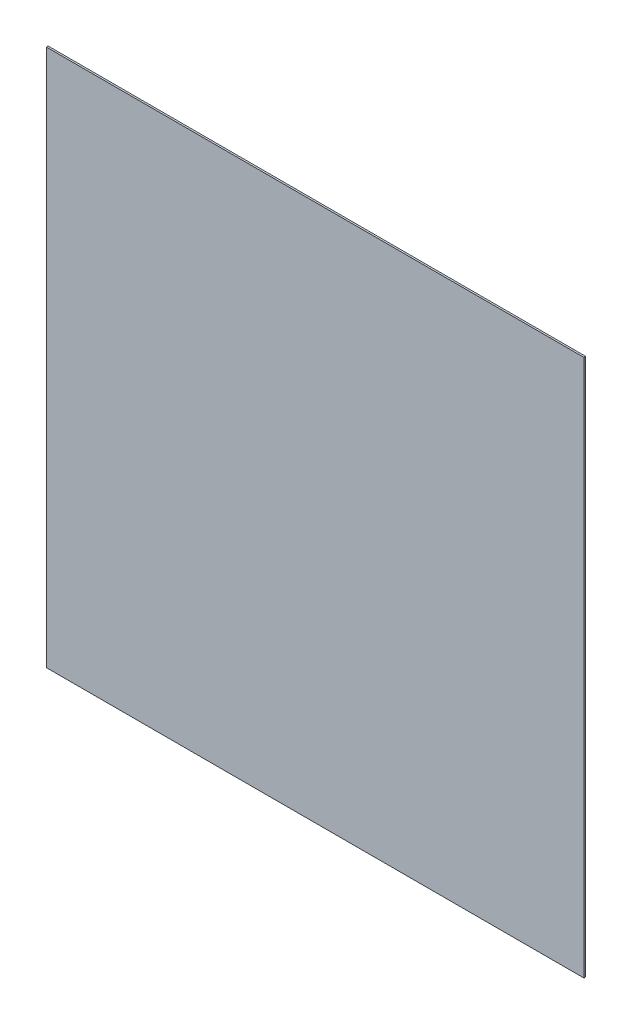
ISO-10303-21;
HEADER;
FILE_DESCRIPTION(('STEP AP214'),'2;1');
FILE_NAME('part.step','',(''),(''),'','','');
FILE_SCHEMA(('AUTOMOTIVE_DESIGN { 1 0 10303 214 1 1 1 1 }'));
ENDSEC;
DATA;
#1=APPLICATION_CONTEXT('core data for automotive mechanical design processes');
#2=APPLICATION_PROTOCOL_DEFINITION('international standard','automotive_design',2000,#1);
#3=PRODUCT_CONTEXT('',#1,'mechanical');
#4=PRODUCT('Part','Part','',(#3));
#5=PRODUCT_RELATED_PRODUCT_CATEGORY('part','',(#4));
#6=PRODUCT_DEFINITION_FORMATION('','',#4);
#7=PRODUCT_DEFINITION_CONTEXT('part definition',#1,'design');
#8=PRODUCT_DEFINITION('design','',#6,#7);
#9=PRODUCT_DEFINITION_SHAPE('','',#8);
#10=(LENGTH_UNIT() NAMED_UNIT(*) SI_UNIT(.MILLI.,.METRE.));
#11=(NAMED_UNIT(*) PLANE_ANGLE_UNIT() SI_UNIT($,.RADIAN.));
#12=(NAMED_UNIT(*) SI_UNIT($,.STERADIAN.) SOLID_ANGLE_UNIT());
#13=UNCERTAINTY_MEASURE_WITH_UNIT(LENGTH_MEASURE(1.E-05),#10,'distance_accuracy_value','');
#14=(GEOMETRIC_REPRESENTATION_CONTEXT(3) GLOBAL_UNCERTAINTY_ASSIGNED_CONTEXT((#13)) GLOBAL_UNIT_ASSIGNED_CONTEXT((#10,
#11,#12)) REPRESENTATION_CONTEXT('',''));
#15=CARTESIAN_POINT('',(0.,0.,0.));
#16=DIRECTION('',(0.,0.,1.));
#17=DIRECTION('',(1.,0.,0.));
#18=AXIS2_PLACEMENT_3D('',#15,#16,#17);
#19=CARTESIAN_POINT('',(150.,-150.,1.));
#20=DIRECTION('',(-1.,0.,0.));
#21=DIRECTION('',(0.,0.,1.));
#22=AXIS2_PLACEMENT_3D('',#19,#20,#21);
#23=PLANE('',#22);
#24=DIRECTION('',(0.,1.,0.));
#25=VECTOR('',#24,1.);
#26=CARTESIAN_POINT('',(150.,-150.,0.));
#27=LINE('',#26,#25);
#28=CARTESIAN_POINT('',(150.,-150.,0.));
#29=VERTEX_POINT('',#28);
#30=CARTESIAN_POINT('',(150.,150.,0.));
#31=VERTEX_POINT('',#30);
#32=EDGE_CURVE('E107',#29,#31,#27,.T.);
#33=ORIENTED_EDGE('',*,*,#32,.T.);
#34=DIRECTION('',(0.,0.,-1.));
#35=VECTOR('',#34,1.);
#36=CARTESIAN_POINT('',(150.,150.,1.));
#37=LINE('',#36,#35);
#38=CARTESIAN_POINT('',(150.,150.,1.));
#39=VERTEX_POINT('',#38);
#40=EDGE_CURVE('E11',#39,#31,#37,.T.);
#41=ORIENTED_EDGE('',*,*,#40,.F.);
#42=DIRECTION('',(0.,1.,0.));
#43=VECTOR('',#42,1.);
#44=CARTESIAN_POINT('',(150.,-150.,1.));
#45=LINE('',#44,#43);
#46=CARTESIAN_POINT('',(150.,-150.,1.));
#47=VERTEX_POINT('',#46);
#48=EDGE_CURVE('E91',#47,#39,#45,.T.);
#49=ORIENTED_EDGE('',*,*,#48,.F.);
#50=DIRECTION('',(0.,0.,-1.));
#51=VECTOR('',#50,1.);
#52=CARTESIAN_POINT('',(150.,-150.,1.));
#53=LINE('',#52,#51);
#54=EDGE_CURVE('E103',#47,#29,#53,.T.);
#55=ORIENTED_EDGE('',*,*,#54,.T.);
#56=EDGE_LOOP('',(#33,#41,#49,#55));
#57=FACE_BOUND('',#56,.T.);
#58=ADVANCED_FACE('F39',(#57),#23,.F.);
#59=CARTESIAN_POINT('',(-150.,150.,1.));
#60=DIRECTION('',(0.,-1.,0.));
#61=DIRECTION('',(0.,0.,-1.));
#62=AXIS2_PLACEMENT_3D('',#59,#60,#61);
#63=PLANE('',#62);
#64=DIRECTION('',(-1.,0.,0.));
#65=VECTOR('',#64,1.);
#66=CARTESIAN_POINT('',(-150.,150.,0.));
#67=LINE('',#66,#65);
#68=CARTESIAN_POINT('',(-150.,150.,0.));
#69=VERTEX_POINT('',#68);
#70=EDGE_CURVE('E96',#31,#69,#67,.T.);
#71=ORIENTED_EDGE('',*,*,#70,.T.);
#72=DIRECTION('',(0.,0.,-1.));
#73=VECTOR('',#72,1.);
#74=CARTESIAN_POINT('',(-150.,150.,1.));
#75=LINE('',#74,#73);
#76=CARTESIAN_POINT('',(-150.,150.,1.));
#77=VERTEX_POINT('',#76);
#78=EDGE_CURVE('E48',#77,#69,#75,.T.);
#79=ORIENTED_EDGE('',*,*,#78,.F.);
#80=DIRECTION('',(-1.,0.,0.));
#81=VECTOR('',#80,1.);
#82=CARTESIAN_POINT('',(-150.,150.,1.));
#83=LINE('',#82,#81);
#84=EDGE_CURVE('E86',#39,#77,#83,.T.);
#85=ORIENTED_EDGE('',*,*,#84,.F.);
#86=ORIENTED_EDGE('',*,*,#40,.T.);
#87=EDGE_LOOP('',(#71,#79,#85,#86));
#88=FACE_BOUND('',#87,.T.);
#89=ADVANCED_FACE('F95',(#88),#63,.F.);
#90=CARTESIAN_POINT('',(-150.,-150.,1.));
#91=DIRECTION('',(1.,0.,0.));
#92=DIRECTION('',(0.,0.,-1.));
#93=AXIS2_PLACEMENT_3D('',#90,#91,#92);
#94=PLANE('',#93);
#95=DIRECTION('',(0.,-1.,0.));
#96=VECTOR('',#95,1.);
#97=CARTESIAN_POINT('',(-150.,-150.,0.));
#98=LINE('',#97,#96);
#99=CARTESIAN_POINT('',(-150.,-150.,0.));
#100=VERTEX_POINT('',#99);
#101=EDGE_CURVE('E73',#69,#100,#98,.T.);
#102=ORIENTED_EDGE('',*,*,#101,.T.);
#103=DIRECTION('',(0.,0.,-1.));
#104=VECTOR('',#103,1.);
#105=CARTESIAN_POINT('',(-150.,-150.,1.));
#106=LINE('',#105,#104);
#107=CARTESIAN_POINT('',(-150.,-150.,1.));
#108=VERTEX_POINT('',#107);
#109=EDGE_CURVE('E98',#108,#100,#106,.T.);
#110=ORIENTED_EDGE('',*,*,#109,.F.);
#111=DIRECTION('',(0.,-1.,0.));
#112=VECTOR('',#111,1.);
#113=CARTESIAN_POINT('',(-150.,-150.,1.));
#114=LINE('',#113,#112);
#115=EDGE_CURVE('E89',#77,#108,#114,.T.);
#116=ORIENTED_EDGE('',*,*,#115,.F.);
#117=ORIENTED_EDGE('',*,*,#78,.T.);
#118=EDGE_LOOP('',(#102,#110,#116,#117));
#119=FACE_BOUND('',#118,.T.);
#120=ADVANCED_FACE('F99',(#119),#94,.F.);
#121=CARTESIAN_POINT('',(-150.,-150.,1.));
#122=DIRECTION('',(0.,1.,0.));
#123=DIRECTION('',(0.,0.,1.));
#124=AXIS2_PLACEMENT_3D('',#121,#122,#123);
#125=PLANE('',#124);
#126=DIRECTION('',(1.,0.,0.));
#127=VECTOR('',#126,1.);
#128=CARTESIAN_POINT('',(-150.,-150.,0.));
#129=LINE('',#128,#127);
#130=EDGE_CURVE('E79',#100,#29,#129,.T.);
#131=ORIENTED_EDGE('',*,*,#130,.T.);
#132=ORIENTED_EDGE('',*,*,#54,.F.);
#133=DIRECTION('',(1.,0.,0.));
#134=VECTOR('',#133,1.);
#135=CARTESIAN_POINT('',(-150.,-150.,1.));
#136=LINE('',#135,#134);
#137=EDGE_CURVE('E56',#108,#47,#136,.T.);
#138=ORIENTED_EDGE('',*,*,#137,.F.);
#139=ORIENTED_EDGE('',*,*,#109,.T.);
#140=EDGE_LOOP('',(#131,#132,#138,#139));
#141=FACE_BOUND('',#140,.T.);
#142=ADVANCED_FACE('F120',(#141),#125,.F.);
#143=CARTESIAN_POINT('',(0.,0.,1.));
#144=DIRECTION('',(0.,0.,-1.));
#145=DIRECTION('',(-1.,0.,0.));
#146=AXIS2_PLACEMENT_3D('',#143,#144,#145);
#147=PLANE('',#146);
#148=ORIENTED_EDGE('',*,*,#48,.T.);
#149=ORIENTED_EDGE('',*,*,#84,.T.);
#150=ORIENTED_EDGE('',*,*,#115,.T.);
#151=ORIENTED_EDGE('',*,*,#137,.T.);
#152=EDGE_LOOP('',(#148,#149,#150,#151));
#153=FACE_BOUND('',#152,.T.);
#154=ADVANCED_FACE('F87',(#153),#147,.F.);
#155=CARTESIAN_POINT('',(0.,0.,0.));
#156=DIRECTION('',(0.,0.,-1.));
#157=DIRECTION('',(-1.,0.,0.));
#158=AXIS2_PLACEMENT_3D('',#155,#156,#157);
#159=PLANE('',#158);
#160=ORIENTED_EDGE('',*,*,#32,.F.);
#161=ORIENTED_EDGE('',*,*,#130,.F.);
#162=ORIENTED_EDGE('',*,*,#101,.F.);
#163=ORIENTED_EDGE('',*,*,#70,.F.);
#164=EDGE_LOOP('',(#160,#161,#162,#163));
#165=FACE_BOUND('',#164,.T.);
#166=ADVANCED_FACE('F123',(#165),#159,.T.);
#167=CLOSED_SHELL('',(#58,#89,#120,#142,#154,#166));
#168=MANIFOLD_SOLID_BREP('B2',#167);
#169=ADVANCED_BREP_SHAPE_REPRESENTATION('',(#18,#168),#14);
#170=SHAPE_DEFINITION_REPRESENTATION(#9,#169);
ENDSEC;
END-ISO-10303-21;
